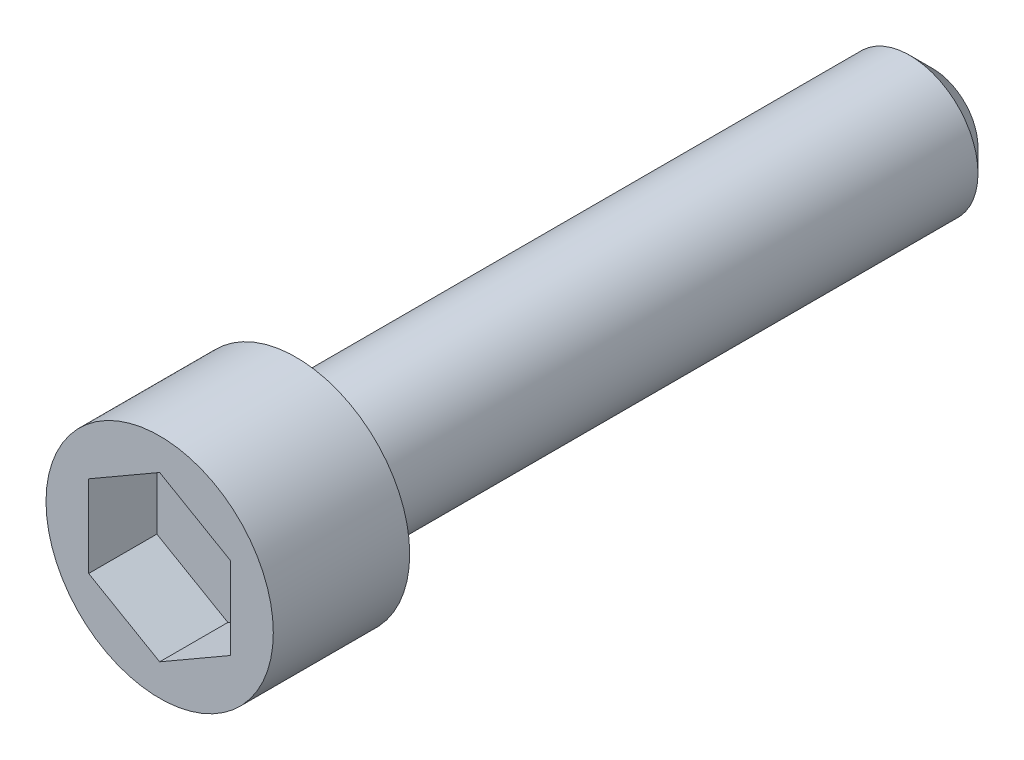
ISO-10303-21;
HEADER;
FILE_DESCRIPTION(('STEP AP214'),'2;1');
FILE_NAME('part.step','',(''),(''),'','','');
FILE_SCHEMA(('AUTOMOTIVE_DESIGN { 1 0 10303 214 1 1 1 1 }'));
ENDSEC;
DATA;
#1=APPLICATION_CONTEXT('core data for automotive mechanical design processes');
#2=APPLICATION_PROTOCOL_DEFINITION('international standard','automotive_design',2000,#1);
#3=PRODUCT_CONTEXT('',#1,'mechanical');
#4=PRODUCT('Part','Part','',(#3));
#5=PRODUCT_RELATED_PRODUCT_CATEGORY('part','',(#4));
#6=PRODUCT_DEFINITION_FORMATION('','',#4);
#7=PRODUCT_DEFINITION_CONTEXT('part definition',#1,'design');
#8=PRODUCT_DEFINITION('design','',#6,#7);
#9=PRODUCT_DEFINITION_SHAPE('','',#8);
#10=(LENGTH_UNIT() NAMED_UNIT(*) SI_UNIT(.MILLI.,.METRE.));
#11=(NAMED_UNIT(*) PLANE_ANGLE_UNIT() SI_UNIT($,.RADIAN.));
#12=(NAMED_UNIT(*) SI_UNIT($,.STERADIAN.) SOLID_ANGLE_UNIT());
#13=UNCERTAINTY_MEASURE_WITH_UNIT(LENGTH_MEASURE(1.E-05),#10,'distance_accuracy_value','');
#14=(GEOMETRIC_REPRESENTATION_CONTEXT(3) GLOBAL_UNCERTAINTY_ASSIGNED_CONTEXT((#13)) GLOBAL_UNIT_ASSIGNED_CONTEXT((#10,
#11,#12)) REPRESENTATION_CONTEXT('',''));
#15=CARTESIAN_POINT('',(0.,0.,0.));
#16=DIRECTION('',(0.,0.,1.));
#17=DIRECTION('',(1.,0.,0.));
#18=AXIS2_PLACEMENT_3D('',#15,#16,#17);
#19=CARTESIAN_POINT('',(0.,0.,14.));
#20=DIRECTION('',(0.,0.,-1.));
#21=DIRECTION('',(-1.,0.,0.));
#22=AXIS2_PLACEMENT_3D('',#19,#20,#21);
#23=CYLINDRICAL_SURFACE('',#22,1.5);
#24=CARTESIAN_POINT('',(0.,0.,0.500000000000002));
#25=DIRECTION('',(0.,0.,1.));
#26=DIRECTION('',(1.,0.,0.));
#27=AXIS2_PLACEMENT_3D('',#24,#25,#26);
#28=CIRCLE('',#27,1.5);
#29=CARTESIAN_POINT('',(1.5,0.,0.500000000000002));
#30=VERTEX_POINT('',#29);
#31=EDGE_CURVE('E44',#30,#30,#28,.T.);
#32=ORIENTED_EDGE('',*,*,#31,.T.);
#33=EDGE_LOOP('',(#32));
#34=FACE_BOUND('',#33,.T.);
#35=CARTESIAN_POINT('',(0.,0.,14.));
#36=DIRECTION('',(0.,0.,1.));
#37=DIRECTION('',(1.,0.,0.));
#38=AXIS2_PLACEMENT_3D('',#35,#36,#37);
#39=CIRCLE('',#38,1.5);
#40=CARTESIAN_POINT('',(1.5,0.,14.));
#41=VERTEX_POINT('',#40);
#42=EDGE_CURVE('E147',#41,#41,#39,.T.);
#43=ORIENTED_EDGE('',*,*,#42,.F.);
#44=EDGE_LOOP('',(#43));
#45=FACE_BOUND('',#44,.T.);
#46=ADVANCED_FACE('F36',(#34,#45),#23,.T.);
#47=CARTESIAN_POINT('',(0.,0.,0.));
#48=DIRECTION('',(0.,0.,1.));
#49=DIRECTION('',(1.,0.,0.));
#50=AXIS2_PLACEMENT_3D('',#47,#48,#49);
#51=PLANE('',#50);
#52=CARTESIAN_POINT('',(0.,0.,0.));
#53=DIRECTION('',(0.,0.,1.));
#54=DIRECTION('',(1.,0.,0.));
#55=AXIS2_PLACEMENT_3D('',#52,#53,#54);
#56=CIRCLE('',#55,0.999999999999996);
#57=CARTESIAN_POINT('',(0.999999999999996,0.,0.));
#58=VERTEX_POINT('',#57);
#59=EDGE_CURVE('E11',#58,#58,#56,.F.);
#60=ORIENTED_EDGE('',*,*,#59,.T.);
#61=EDGE_LOOP('',(#60));
#62=FACE_BOUND('',#61,.T.);
#63=ADVANCED_FACE('F165',(#62),#51,.F.);
#64=CARTESIAN_POINT('',(0.,0.,17.));
#65=DIRECTION('',(0.,0.,-1.));
#66=DIRECTION('',(-1.,0.,0.));
#67=AXIS2_PLACEMENT_3D('',#64,#65,#66);
#68=CYLINDRICAL_SURFACE('',#67,2.5);
#69=CARTESIAN_POINT('',(0.,0.,17.));
#70=DIRECTION('',(0.,0.,1.));
#71=DIRECTION('',(1.,0.,0.));
#72=AXIS2_PLACEMENT_3D('',#69,#70,#71);
#73=CIRCLE('',#72,2.5);
#74=CARTESIAN_POINT('',(2.5,0.,17.));
#75=VERTEX_POINT('',#74);
#76=EDGE_CURVE('E144',#75,#75,#73,.T.);
#77=ORIENTED_EDGE('',*,*,#76,.F.);
#78=EDGE_LOOP('',(#77));
#79=FACE_BOUND('',#78,.T.);
#80=CARTESIAN_POINT('',(0.,0.,14.));
#81=DIRECTION('',(0.,0.,1.));
#82=DIRECTION('',(1.,0.,0.));
#83=AXIS2_PLACEMENT_3D('',#80,#81,#82);
#84=CIRCLE('',#83,2.5);
#85=CARTESIAN_POINT('',(2.5,0.,14.));
#86=VERTEX_POINT('',#85);
#87=EDGE_CURVE('E138',#86,#86,#84,.T.);
#88=ORIENTED_EDGE('',*,*,#87,.T.);
#89=EDGE_LOOP('',(#88));
#90=FACE_BOUND('',#89,.T.);
#91=ADVANCED_FACE('F169',(#79,#90),#68,.T.);
#92=CARTESIAN_POINT('',(0.,0.,17.));
#93=DIRECTION('',(0.,0.,1.));
#94=DIRECTION('',(1.,0.,0.));
#95=AXIS2_PLACEMENT_3D('',#92,#93,#94);
#96=PLANE('',#95);
#97=DIRECTION('',(-0.866025403784442,0.499999999999995,0.));
#98=VECTOR('',#97,1.);
#99=CARTESIAN_POINT('',(1.56177486979958,0.901691141492407,17.));
#100=LINE('',#99,#98);
#101=CARTESIAN_POINT('',(1.56177486979958,0.901691141492407,17.));
#102=VERTEX_POINT('',#101);
#103=CARTESIAN_POINT('',(0.,1.80338228298478,17.));
#104=VERTEX_POINT('',#103);
#105=EDGE_CURVE('E51',#102,#104,#100,.T.);
#106=ORIENTED_EDGE('',*,*,#105,.F.);
#107=DIRECTION('',(0.,1.,0.));
#108=VECTOR('',#107,1.);
#109=CARTESIAN_POINT('',(1.5617748697996,-0.901691141492374,17.));
#110=LINE('',#109,#108);
#111=CARTESIAN_POINT('',(1.5617748697996,-0.901691141492374,17.));
#112=VERTEX_POINT('',#111);
#113=EDGE_CURVE('E134',#112,#102,#110,.T.);
#114=ORIENTED_EDGE('',*,*,#113,.F.);
#115=DIRECTION('',(0.866025403784435,0.500000000000007,0.));
#116=VECTOR('',#115,1.);
#117=CARTESIAN_POINT('',(0.,-1.80338228298478,17.));
#118=LINE('',#117,#116);
#119=CARTESIAN_POINT('',(0.,-1.80338228298478,17.));
#120=VERTEX_POINT('',#119);
#121=EDGE_CURVE('E132',#120,#112,#118,.T.);
#122=ORIENTED_EDGE('',*,*,#121,.F.);
#123=DIRECTION('',(0.866025403784441,-0.499999999999995,0.));
#124=VECTOR('',#123,1.);
#125=CARTESIAN_POINT('',(-1.56177486979959,-0.901691141492395,17.));
#126=LINE('',#125,#124);
#127=CARTESIAN_POINT('',(-1.56177486979959,-0.901691141492395,17.));
#128=VERTEX_POINT('',#127);
#129=EDGE_CURVE('E99',#128,#120,#126,.T.);
#130=ORIENTED_EDGE('',*,*,#129,.F.);
#131=DIRECTION('',(0.,-1.,0.));
#132=VECTOR('',#131,1.);
#133=CARTESIAN_POINT('',(-1.5617748697996,0.901691141492385,17.));
#134=LINE('',#133,#132);
#135=CARTESIAN_POINT('',(-1.5617748697996,0.901691141492385,17.));
#136=VERTEX_POINT('',#135);
#137=EDGE_CURVE('E128',#136,#128,#134,.T.);
#138=ORIENTED_EDGE('',*,*,#137,.F.);
#139=DIRECTION('',(-0.866025403784438,-0.500000000000001,0.));
#140=VECTOR('',#139,1.);
#141=CARTESIAN_POINT('',(0.,1.80338228298478,17.));
#142=LINE('',#141,#140);
#143=EDGE_CURVE('E125',#104,#136,#142,.T.);
#144=ORIENTED_EDGE('',*,*,#143,.F.);
#145=EDGE_LOOP('',(#106,#114,#122,#130,#138,#144));
#146=FACE_BOUND('',#145,.T.);
#147=ORIENTED_EDGE('',*,*,#76,.T.);
#148=EDGE_LOOP('',(#147));
#149=FACE_BOUND('',#148,.T.);
#150=ADVANCED_FACE('F175',(#146,#149),#96,.T.);
#151=CARTESIAN_POINT('',(0.,0.,14.));
#152=DIRECTION('',(0.,0.,1.));
#153=DIRECTION('',(1.,0.,0.));
#154=AXIS2_PLACEMENT_3D('',#151,#152,#153);
#155=PLANE('',#154);
#156=ORIENTED_EDGE('',*,*,#42,.T.);
#157=EDGE_LOOP('',(#156));
#158=FACE_BOUND('',#157,.T.);
#159=ORIENTED_EDGE('',*,*,#87,.F.);
#160=EDGE_LOOP('',(#159));
#161=FACE_BOUND('',#160,.T.);
#162=ADVANCED_FACE('F177',(#158,#161),#155,.F.);
#163=CARTESIAN_POINT('',(1.56177486979958,0.901691141492407,15.5));
#164=DIRECTION('',(0.499999999999995,0.866025403784441,0.));
#165=DIRECTION('',(-0.866025403784442,0.499999999999995,0.));
#166=AXIS2_PLACEMENT_3D('',#163,#164,#165);
#167=PLANE('',#166);
#168=ORIENTED_EDGE('',*,*,#105,.T.);
#169=DIRECTION('',(0.,0.,1.));
#170=VECTOR('',#169,1.);
#171=CARTESIAN_POINT('',(0.,1.80338228298478,15.5));
#172=LINE('',#171,#170);
#173=CARTESIAN_POINT('',(0.,1.80338228298478,15.5));
#174=VERTEX_POINT('',#173);
#175=EDGE_CURVE('E81',#174,#104,#172,.T.);
#176=ORIENTED_EDGE('',*,*,#175,.F.);
#177=DIRECTION('',(-0.866025403784442,0.499999999999995,0.));
#178=VECTOR('',#177,1.);
#179=CARTESIAN_POINT('',(1.56177486979958,0.901691141492407,15.5));
#180=LINE('',#179,#178);
#181=CARTESIAN_POINT('',(1.56177486979958,0.901691141492407,15.5));
#182=VERTEX_POINT('',#181);
#183=EDGE_CURVE('E136',#182,#174,#180,.T.);
#184=ORIENTED_EDGE('',*,*,#183,.F.);
#185=DIRECTION('',(0.,0.,1.));
#186=VECTOR('',#185,1.);
#187=CARTESIAN_POINT('',(1.56177486979958,0.901691141492407,15.5));
#188=LINE('',#187,#186);
#189=EDGE_CURVE('E59',#182,#102,#188,.T.);
#190=ORIENTED_EDGE('',*,*,#189,.T.);
#191=EDGE_LOOP('',(#168,#176,#184,#190));
#192=FACE_BOUND('',#191,.T.);
#193=ADVANCED_FACE('F180',(#192),#167,.F.);
#194=CARTESIAN_POINT('',(1.5617748697996,-0.901691141492374,15.5));
#195=DIRECTION('',(1.,0.,0.));
#196=DIRECTION('',(0.,1.,0.));
#197=AXIS2_PLACEMENT_3D('',#194,#195,#196);
#198=PLANE('',#197);
#199=ORIENTED_EDGE('',*,*,#113,.T.);
#200=ORIENTED_EDGE('',*,*,#189,.F.);
#201=DIRECTION('',(0.,1.,0.));
#202=VECTOR('',#201,1.);
#203=CARTESIAN_POINT('',(1.5617748697996,-0.901691141492374,15.5));
#204=LINE('',#203,#202);
#205=CARTESIAN_POINT('',(1.5617748697996,-0.901691141492374,15.5));
#206=VERTEX_POINT('',#205);
#207=EDGE_CURVE('E111',#206,#182,#204,.T.);
#208=ORIENTED_EDGE('',*,*,#207,.F.);
#209=DIRECTION('',(0.,0.,1.));
#210=VECTOR('',#209,1.);
#211=CARTESIAN_POINT('',(1.5617748697996,-0.901691141492374,15.5));
#212=LINE('',#211,#210);
#213=EDGE_CURVE('E103',#206,#112,#212,.T.);
#214=ORIENTED_EDGE('',*,*,#213,.T.);
#215=EDGE_LOOP('',(#199,#200,#208,#214));
#216=FACE_BOUND('',#215,.T.);
#217=ADVANCED_FACE('F187',(#216),#198,.F.);
#218=CARTESIAN_POINT('',(0.,-1.80338228298478,15.5));
#219=DIRECTION('',(0.500000000000007,-0.866025403784435,0.));
#220=DIRECTION('',(0.866025403784434,0.500000000000007,0.));
#221=AXIS2_PLACEMENT_3D('',#218,#219,#220);
#222=PLANE('',#221);
#223=ORIENTED_EDGE('',*,*,#121,.T.);
#224=ORIENTED_EDGE('',*,*,#213,.F.);
#225=DIRECTION('',(0.866025403784435,0.500000000000007,0.));
#226=VECTOR('',#225,1.);
#227=CARTESIAN_POINT('',(0.,-1.80338228298478,15.5));
#228=LINE('',#227,#226);
#229=CARTESIAN_POINT('',(0.,-1.80338228298478,15.5));
#230=VERTEX_POINT('',#229);
#231=EDGE_CURVE('E107',#230,#206,#228,.T.);
#232=ORIENTED_EDGE('',*,*,#231,.F.);
#233=DIRECTION('',(0.,0.,1.));
#234=VECTOR('',#233,1.);
#235=CARTESIAN_POINT('',(0.,-1.80338228298478,15.5));
#236=LINE('',#235,#234);
#237=EDGE_CURVE('E92',#230,#120,#236,.T.);
#238=ORIENTED_EDGE('',*,*,#237,.T.);
#239=EDGE_LOOP('',(#223,#224,#232,#238));
#240=FACE_BOUND('',#239,.T.);
#241=ADVANCED_FACE('F108',(#240),#222,.F.);
#242=CARTESIAN_POINT('',(-1.56177486979959,-0.901691141492395,15.5));
#243=DIRECTION('',(-0.499999999999995,-0.866025403784441,0.));
#244=DIRECTION('',(0.866025403784442,-0.499999999999995,0.));
#245=AXIS2_PLACEMENT_3D('',#242,#243,#244);
#246=PLANE('',#245);
#247=ORIENTED_EDGE('',*,*,#129,.T.);
#248=ORIENTED_EDGE('',*,*,#237,.F.);
#249=DIRECTION('',(0.866025403784441,-0.499999999999995,0.));
#250=VECTOR('',#249,1.);
#251=CARTESIAN_POINT('',(-1.56177486979959,-0.901691141492395,15.5));
#252=LINE('',#251,#250);
#253=CARTESIAN_POINT('',(-1.56177486979959,-0.901691141492395,15.5));
#254=VERTEX_POINT('',#253);
#255=EDGE_CURVE('E96',#254,#230,#252,.T.);
#256=ORIENTED_EDGE('',*,*,#255,.F.);
#257=DIRECTION('',(0.,0.,1.));
#258=VECTOR('',#257,1.);
#259=CARTESIAN_POINT('',(-1.56177486979959,-0.901691141492395,15.5));
#260=LINE('',#259,#258);
#261=EDGE_CURVE('E104',#254,#128,#260,.T.);
#262=ORIENTED_EDGE('',*,*,#261,.T.);
#263=EDGE_LOOP('',(#247,#248,#256,#262));
#264=FACE_BOUND('',#263,.T.);
#265=ADVANCED_FACE('F94',(#264),#246,.F.);
#266=CARTESIAN_POINT('',(-1.5617748697996,0.901691141492385,15.5));
#267=DIRECTION('',(-1.,0.,0.));
#268=DIRECTION('',(0.,-1.,0.));
#269=AXIS2_PLACEMENT_3D('',#266,#267,#268);
#270=PLANE('',#269);
#271=ORIENTED_EDGE('',*,*,#137,.T.);
#272=ORIENTED_EDGE('',*,*,#261,.F.);
#273=DIRECTION('',(0.,-1.,0.));
#274=VECTOR('',#273,1.);
#275=CARTESIAN_POINT('',(-1.5617748697996,0.901691141492385,15.5));
#276=LINE('',#275,#274);
#277=CARTESIAN_POINT('',(-1.5617748697996,0.901691141492385,15.5));
#278=VERTEX_POINT('',#277);
#279=EDGE_CURVE('E117',#278,#254,#276,.T.);
#280=ORIENTED_EDGE('',*,*,#279,.F.);
#281=DIRECTION('',(0.,0.,1.));
#282=VECTOR('',#281,1.);
#283=CARTESIAN_POINT('',(-1.5617748697996,0.901691141492385,15.5));
#284=LINE('',#283,#282);
#285=EDGE_CURVE('E141',#278,#136,#284,.T.);
#286=ORIENTED_EDGE('',*,*,#285,.T.);
#287=EDGE_LOOP('',(#271,#272,#280,#286));
#288=FACE_BOUND('',#287,.T.);
#289=ADVANCED_FACE('F190',(#288),#270,.F.);
#290=CARTESIAN_POINT('',(0.,1.80338228298478,15.5));
#291=DIRECTION('',(-0.500000000000001,0.866025403784438,0.));
#292=DIRECTION('',(-0.866025403784438,-0.500000000000001,0.));
#293=AXIS2_PLACEMENT_3D('',#290,#291,#292);
#294=PLANE('',#293);
#295=ORIENTED_EDGE('',*,*,#143,.T.);
#296=ORIENTED_EDGE('',*,*,#285,.F.);
#297=DIRECTION('',(-0.866025403784438,-0.500000000000001,0.));
#298=VECTOR('',#297,1.);
#299=CARTESIAN_POINT('',(0.,1.80338228298478,15.5));
#300=LINE('',#299,#298);
#301=EDGE_CURVE('E119',#174,#278,#300,.T.);
#302=ORIENTED_EDGE('',*,*,#301,.F.);
#303=ORIENTED_EDGE('',*,*,#175,.T.);
#304=EDGE_LOOP('',(#295,#296,#302,#303));
#305=FACE_BOUND('',#304,.T.);
#306=ADVANCED_FACE('F161',(#305),#294,.F.);
#307=CARTESIAN_POINT('',(0.,0.,15.5));
#308=DIRECTION('',(0.,0.,1.));
#309=DIRECTION('',(1.,0.,0.));
#310=AXIS2_PLACEMENT_3D('',#307,#308,#309);
#311=PLANE('',#310);
#312=ORIENTED_EDGE('',*,*,#183,.T.);
#313=ORIENTED_EDGE('',*,*,#301,.T.);
#314=ORIENTED_EDGE('',*,*,#279,.T.);
#315=ORIENTED_EDGE('',*,*,#255,.T.);
#316=ORIENTED_EDGE('',*,*,#231,.T.);
#317=ORIENTED_EDGE('',*,*,#207,.T.);
#318=EDGE_LOOP('',(#312,#313,#314,#315,#316,#317));
#319=FACE_BOUND('',#318,.T.);
#320=ADVANCED_FACE('F114',(#319),#311,.T.);
#321=CARTESIAN_POINT('',(0.,0.,0.500000000000002));
#322=DIRECTION('',(0.,0.,1.));
#323=DIRECTION('',(1.,0.,0.));
#324=AXIS2_PLACEMENT_3D('',#321,#322,#323);
#325=CONICAL_SURFACE('',#324,1.5,0.785398163397452);
#326=ORIENTED_EDGE('',*,*,#59,.F.);
#327=EDGE_LOOP('',(#326));
#328=FACE_BOUND('',#327,.T.);
#329=ORIENTED_EDGE('',*,*,#31,.F.);
#330=EDGE_LOOP('',(#329));
#331=FACE_BOUND('',#330,.T.);
#332=ADVANCED_FACE('F38',(#328,#331),#325,.T.);
#333=CLOSED_SHELL('',(#46,#63,#91,#150,#162,#193,#217,#241,#265,#289,#306,#320,#332));
#334=MANIFOLD_SOLID_BREP('B2',#333);
#335=ADVANCED_BREP_SHAPE_REPRESENTATION('',(#18,#334),#14);
#336=SHAPE_DEFINITION_REPRESENTATION(#9,#335);
ENDSEC;
END-ISO-10303-21;
